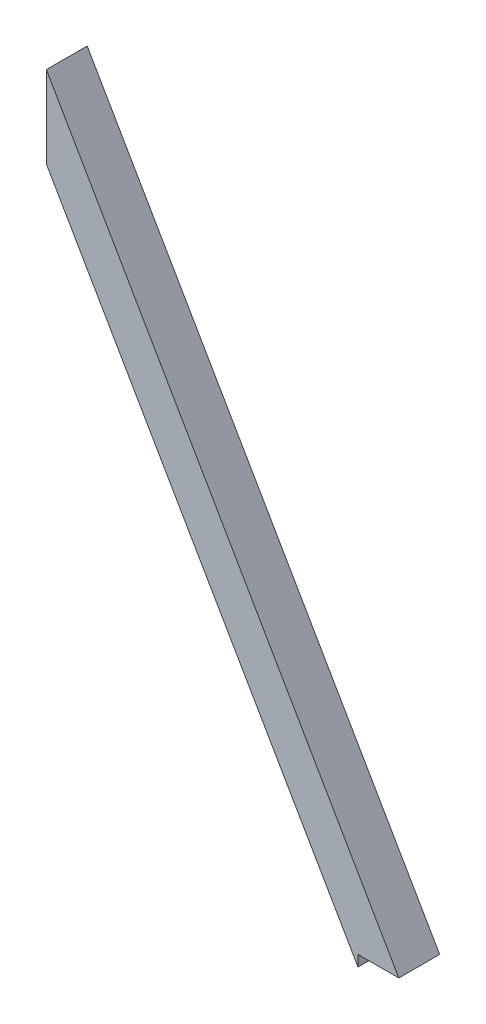
ISO-10303-21;
HEADER;
FILE_DESCRIPTION(('STEP AP214'),'2;1');
FILE_NAME('part.step','',(''),(''),'','','');
FILE_SCHEMA(('AUTOMOTIVE_DESIGN { 1 0 10303 214 1 1 1 1 }'));
ENDSEC;
DATA;
#1=APPLICATION_CONTEXT('core data for automotive mechanical design processes');
#2=APPLICATION_PROTOCOL_DEFINITION('international standard','automotive_design',2000,#1);
#3=PRODUCT_CONTEXT('',#1,'mechanical');
#4=PRODUCT('Part','Part','',(#3));
#5=PRODUCT_RELATED_PRODUCT_CATEGORY('part','',(#4));
#6=PRODUCT_DEFINITION_FORMATION('','',#4);
#7=PRODUCT_DEFINITION_CONTEXT('part definition',#1,'design');
#8=PRODUCT_DEFINITION('design','',#6,#7);
#9=PRODUCT_DEFINITION_SHAPE('','',#8);
#10=(LENGTH_UNIT() NAMED_UNIT(*) SI_UNIT(.MILLI.,.METRE.));
#11=(NAMED_UNIT(*) PLANE_ANGLE_UNIT() SI_UNIT($,.RADIAN.));
#12=(NAMED_UNIT(*) SI_UNIT($,.STERADIAN.) SOLID_ANGLE_UNIT());
#13=UNCERTAINTY_MEASURE_WITH_UNIT(LENGTH_MEASURE(1.E-05),#10,'distance_accuracy_value','');
#14=(GEOMETRIC_REPRESENTATION_CONTEXT(3) GLOBAL_UNCERTAINTY_ASSIGNED_CONTEXT((#13)) GLOBAL_UNIT_ASSIGNED_CONTEXT((#10,
#11,#12)) REPRESENTATION_CONTEXT('',''));
#15=CARTESIAN_POINT('',(0.,0.,0.));
#16=DIRECTION('',(0.,0.,1.));
#17=DIRECTION('',(1.,0.,0.));
#18=AXIS2_PLACEMENT_3D('',#15,#16,#17);
#19=CARTESIAN_POINT('',(219.1893,0.,12.7));
#20=DIRECTION('',(0.,1.,0.));
#21=DIRECTION('',(-1.,0.,0.));
#22=AXIS2_PLACEMENT_3D('',#19,#20,#21);
#23=PLANE('',#22);
#24=DIRECTION('',(1.,0.,0.));
#25=VECTOR('',#24,1.);
#26=CARTESIAN_POINT('',(219.1893,0.,-12.7));
#27=LINE('',#26,#25);
#28=CARTESIAN_POINT('',(193.7893,0.,-12.7));
#29=VERTEX_POINT('',#28);
#30=CARTESIAN_POINT('',(219.1893,0.,-12.7));
#31=VERTEX_POINT('',#30);
#32=EDGE_CURVE('E107',#29,#31,#27,.T.);
#33=ORIENTED_EDGE('',*,*,#32,.T.);
#34=DIRECTION('',(0.,0.,-1.));
#35=VECTOR('',#34,1.);
#36=CARTESIAN_POINT('',(219.1893,0.,12.7));
#37=LINE('',#36,#35);
#38=CARTESIAN_POINT('',(219.1893,0.,12.7));
#39=VERTEX_POINT('',#38);
#40=EDGE_CURVE('E11',#39,#31,#37,.T.);
#41=ORIENTED_EDGE('',*,*,#40,.F.);
#42=DIRECTION('',(1.,0.,0.));
#43=VECTOR('',#42,1.);
#44=CARTESIAN_POINT('',(219.1893,0.,12.7));
#45=LINE('',#44,#43);
#46=CARTESIAN_POINT('',(193.7893,0.,12.7));
#47=VERTEX_POINT('',#46);
#48=EDGE_CURVE('E115',#47,#39,#45,.T.);
#49=ORIENTED_EDGE('',*,*,#48,.F.);
#50=DIRECTION('',(0.,0.,-1.));
#51=VECTOR('',#50,1.);
#52=CARTESIAN_POINT('',(193.7893,0.,12.7));
#53=LINE('',#52,#51);
#54=EDGE_CURVE('E103',#47,#29,#53,.T.);
#55=ORIENTED_EDGE('',*,*,#54,.T.);
#56=EDGE_LOOP('',(#33,#41,#49,#55));
#57=FACE_BOUND('',#56,.T.);
#58=ADVANCED_FACE('F33',(#57),#23,.F.);
#59=CARTESIAN_POINT('',(219.1893,0.,12.7));
#60=DIRECTION('',(-0.866025403784436,-0.500000000000004,0.));
#61=DIRECTION('',(0.500000000000004,-0.866025403784436,0.));
#62=AXIS2_PLACEMENT_3D('',#59,#60,#61);
#63=PLANE('',#62);
#64=DIRECTION('',(-0.500000000000004,0.866025403784436,0.));
#65=VECTOR('',#64,1.);
#66=CARTESIAN_POINT('',(219.1893,0.,-12.7));
#67=LINE('',#66,#65);
#68=CARTESIAN_POINT('',(0.,379.647004075453,-12.7));
#69=VERTEX_POINT('',#68);
#70=EDGE_CURVE('E110',#31,#69,#67,.T.);
#71=ORIENTED_EDGE('',*,*,#70,.T.);
#72=DIRECTION('',(0.,0.,-1.));
#73=VECTOR('',#72,1.);
#74=CARTESIAN_POINT('',(0.,379.647004075453,12.7));
#75=LINE('',#74,#73);
#76=CARTESIAN_POINT('',(0.,379.647004075453,12.7));
#77=VERTEX_POINT('',#76);
#78=EDGE_CURVE('E41',#77,#69,#75,.T.);
#79=ORIENTED_EDGE('',*,*,#78,.F.);
#80=DIRECTION('',(-0.500000000000004,0.866025403784436,0.));
#81=VECTOR('',#80,1.);
#82=CARTESIAN_POINT('',(219.1893,0.,12.7));
#83=LINE('',#82,#81);
#84=EDGE_CURVE('E83',#39,#77,#83,.T.);
#85=ORIENTED_EDGE('',*,*,#84,.F.);
#86=ORIENTED_EDGE('',*,*,#40,.T.);
#87=EDGE_LOOP('',(#71,#79,#85,#86));
#88=FACE_BOUND('',#87,.T.);
#89=ADVANCED_FACE('F134',(#88),#63,.F.);
#90=CARTESIAN_POINT('',(0.,328.847004075453,12.7));
#91=DIRECTION('',(1.,0.,0.));
#92=DIRECTION('',(0.,1.,0.));
#93=AXIS2_PLACEMENT_3D('',#90,#91,#92);
#94=PLANE('',#93);
#95=DIRECTION('',(0.,-1.,0.));
#96=VECTOR('',#95,1.);
#97=CARTESIAN_POINT('',(0.,328.847004075453,-12.7));
#98=LINE('',#97,#96);
#99=CARTESIAN_POINT('',(0.,328.847004075453,-12.7));
#100=VERTEX_POINT('',#99);
#101=EDGE_CURVE('E98',#69,#100,#98,.T.);
#102=ORIENTED_EDGE('',*,*,#101,.T.);
#103=DIRECTION('',(0.,0.,-1.));
#104=VECTOR('',#103,1.);
#105=CARTESIAN_POINT('',(0.,328.847004075453,12.7));
#106=LINE('',#105,#104);
#107=CARTESIAN_POINT('',(0.,328.847004075453,12.7));
#108=VERTEX_POINT('',#107);
#109=EDGE_CURVE('E95',#108,#100,#106,.T.);
#110=ORIENTED_EDGE('',*,*,#109,.F.);
#111=DIRECTION('',(0.,-1.,0.));
#112=VECTOR('',#111,1.);
#113=CARTESIAN_POINT('',(0.,328.847004075453,12.7));
#114=LINE('',#113,#112);
#115=EDGE_CURVE('E87',#77,#108,#114,.T.);
#116=ORIENTED_EDGE('',*,*,#115,.F.);
#117=ORIENTED_EDGE('',*,*,#78,.T.);
#118=EDGE_LOOP('',(#102,#110,#116,#117));
#119=FACE_BOUND('',#118,.T.);
#120=ADVANCED_FACE('F96',(#119),#94,.F.);
#121=CARTESIAN_POINT('',(193.7893,-6.80590948775056,12.7));
#122=DIRECTION('',(0.866025403784436,0.500000000000004,0.));
#123=DIRECTION('',(-0.500000000000004,0.866025403784436,0.));
#124=AXIS2_PLACEMENT_3D('',#121,#122,#123);
#125=PLANE('',#124);
#126=DIRECTION('',(0.500000000000004,-0.866025403784436,0.));
#127=VECTOR('',#126,1.);
#128=CARTESIAN_POINT('',(193.7893,-6.80590948775056,-12.7));
#129=LINE('',#128,#127);
#130=CARTESIAN_POINT('',(193.7893,-6.80590948775056,-12.7));
#131=VERTEX_POINT('',#130);
#132=EDGE_CURVE('E69',#100,#131,#129,.T.);
#133=ORIENTED_EDGE('',*,*,#132,.T.);
#134=DIRECTION('',(0.,0.,-1.));
#135=VECTOR('',#134,1.);
#136=CARTESIAN_POINT('',(193.7893,-6.80590948775056,12.7));
#137=LINE('',#136,#135);
#138=CARTESIAN_POINT('',(193.7893,-6.80590948775056,12.7));
#139=VERTEX_POINT('',#138);
#140=EDGE_CURVE('E99',#139,#131,#137,.T.);
#141=ORIENTED_EDGE('',*,*,#140,.F.);
#142=DIRECTION('',(0.500000000000004,-0.866025403784436,0.));
#143=VECTOR('',#142,1.);
#144=CARTESIAN_POINT('',(193.7893,-6.80590948775056,12.7));
#145=LINE('',#144,#143);
#146=EDGE_CURVE('E91',#108,#139,#145,.T.);
#147=ORIENTED_EDGE('',*,*,#146,.F.);
#148=ORIENTED_EDGE('',*,*,#109,.T.);
#149=EDGE_LOOP('',(#133,#141,#147,#148));
#150=FACE_BOUND('',#149,.T.);
#151=ADVANCED_FACE('F101',(#150),#125,.F.);
#152=CARTESIAN_POINT('',(193.7893,0.,12.7));
#153=DIRECTION('',(-1.,0.,0.));
#154=DIRECTION('',(0.,0.,1.));
#155=AXIS2_PLACEMENT_3D('',#152,#153,#154);
#156=PLANE('',#155);
#157=DIRECTION('',(0.,1.,0.));
#158=VECTOR('',#157,1.);
#159=CARTESIAN_POINT('',(193.7893,0.,-12.7));
#160=LINE('',#159,#158);
#161=EDGE_CURVE('E75',#131,#29,#160,.T.);
#162=ORIENTED_EDGE('',*,*,#161,.T.);
#163=ORIENTED_EDGE('',*,*,#54,.F.);
#164=DIRECTION('',(0.,1.,0.));
#165=VECTOR('',#164,1.);
#166=CARTESIAN_POINT('',(193.7893,0.,12.7));
#167=LINE('',#166,#165);
#168=EDGE_CURVE('E49',#139,#47,#167,.T.);
#169=ORIENTED_EDGE('',*,*,#168,.F.);
#170=ORIENTED_EDGE('',*,*,#140,.T.);
#171=EDGE_LOOP('',(#162,#163,#169,#170));
#172=FACE_BOUND('',#171,.T.);
#173=ADVANCED_FACE('F123',(#172),#156,.F.);
#174=CARTESIAN_POINT('',(0.,0.,12.7));
#175=DIRECTION('',(0.,0.,1.));
#176=DIRECTION('',(1.,0.,0.));
#177=AXIS2_PLACEMENT_3D('',#174,#175,#176);
#178=PLANE('',#177);
#179=ORIENTED_EDGE('',*,*,#48,.T.);
#180=ORIENTED_EDGE('',*,*,#84,.T.);
#181=ORIENTED_EDGE('',*,*,#115,.T.);
#182=ORIENTED_EDGE('',*,*,#146,.T.);
#183=ORIENTED_EDGE('',*,*,#168,.T.);
#184=EDGE_LOOP('',(#179,#180,#181,#182,#183));
#185=FACE_BOUND('',#184,.T.);
#186=ADVANCED_FACE('F89',(#185),#178,.T.);
#187=CARTESIAN_POINT('',(0.,0.,-12.7));
#188=DIRECTION('',(0.,0.,1.));
#189=DIRECTION('',(1.,0.,0.));
#190=AXIS2_PLACEMENT_3D('',#187,#188,#189);
#191=PLANE('',#190);
#192=ORIENTED_EDGE('',*,*,#32,.F.);
#193=ORIENTED_EDGE('',*,*,#161,.F.);
#194=ORIENTED_EDGE('',*,*,#132,.F.);
#195=ORIENTED_EDGE('',*,*,#101,.F.);
#196=ORIENTED_EDGE('',*,*,#70,.F.);
#197=EDGE_LOOP('',(#192,#193,#194,#195,#196));
#198=FACE_BOUND('',#197,.T.);
#199=ADVANCED_FACE('F119',(#198),#191,.F.);
#200=CLOSED_SHELL('',(#58,#89,#120,#151,#173,#186,#199));
#201=MANIFOLD_SOLID_BREP('B2',#200);
#202=ADVANCED_BREP_SHAPE_REPRESENTATION('',(#18,#201),#14);
#203=SHAPE_DEFINITION_REPRESENTATION(#9,#202);
ENDSEC;
END-ISO-10303-21;
